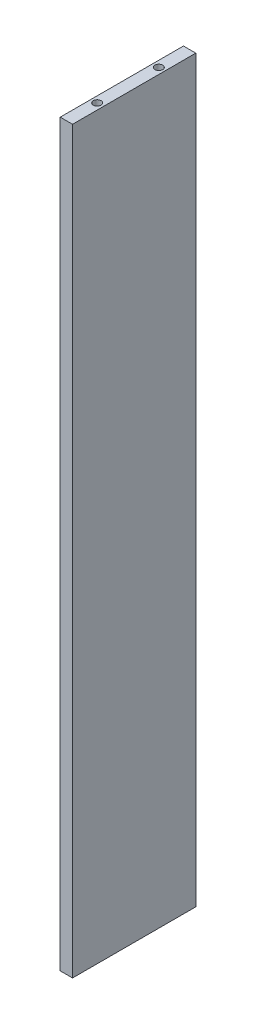
ISO-10303-21;
HEADER;
FILE_DESCRIPTION(('STEP AP214'),'2;1');
FILE_NAME('part.step','',(''),(''),'','','');
FILE_SCHEMA(('AUTOMOTIVE_DESIGN { 1 0 10303 214 1 1 1 1 }'));
ENDSEC;
DATA;
#1=APPLICATION_CONTEXT('core data for automotive mechanical design processes');
#2=APPLICATION_PROTOCOL_DEFINITION('international standard','automotive_design',2000,#1);
#3=PRODUCT_CONTEXT('',#1,'mechanical');
#4=PRODUCT('Part','Part','',(#3));
#5=PRODUCT_RELATED_PRODUCT_CATEGORY('part','',(#4));
#6=PRODUCT_DEFINITION_FORMATION('','',#4);
#7=PRODUCT_DEFINITION_CONTEXT('part definition',#1,'design');
#8=PRODUCT_DEFINITION('design','',#6,#7);
#9=PRODUCT_DEFINITION_SHAPE('','',#8);
#10=(LENGTH_UNIT() NAMED_UNIT(*) SI_UNIT(.MILLI.,.METRE.));
#11=(NAMED_UNIT(*) PLANE_ANGLE_UNIT() SI_UNIT($,.RADIAN.));
#12=(NAMED_UNIT(*) SI_UNIT($,.STERADIAN.) SOLID_ANGLE_UNIT());
#13=UNCERTAINTY_MEASURE_WITH_UNIT(LENGTH_MEASURE(1.E-05),#10,'distance_accuracy_value','');
#14=(GEOMETRIC_REPRESENTATION_CONTEXT(3) GLOBAL_UNCERTAINTY_ASSIGNED_CONTEXT((#13)) GLOBAL_UNIT_ASSIGNED_CONTEXT((#10,
#11,#12)) REPRESENTATION_CONTEXT('',''));
#15=CARTESIAN_POINT('',(0.,0.,0.));
#16=DIRECTION('',(0.,0.,1.));
#17=DIRECTION('',(1.,0.,0.));
#18=AXIS2_PLACEMENT_3D('',#15,#16,#17);
#19=CARTESIAN_POINT('',(0.439938024828799,381.,-58.0586527806087));
#20=DIRECTION('',(1.,0.,0.));
#21=DIRECTION('',(0.,0.,-1.));
#22=AXIS2_PLACEMENT_3D('',#19,#20,#21);
#23=PLANE('',#22);
#24=DIRECTION('',(0.,0.,1.));
#25=VECTOR('',#24,1.);
#26=CARTESIAN_POINT('',(0.439938024828799,0.,-58.0586527806087));
#27=LINE('',#26,#25);
#28=CARTESIAN_POINT('',(0.439938024828799,0.,-58.0586527806087));
#29=VERTEX_POINT('',#28);
#30=CARTESIAN_POINT('',(0.439938024828807,0.,5.44134721939132));
#31=VERTEX_POINT('',#30);
#32=EDGE_CURVE('E125',#29,#31,#27,.T.);
#33=ORIENTED_EDGE('',*,*,#32,.T.);
#34=DIRECTION('',(0.,-1.,0.));
#35=VECTOR('',#34,1.);
#36=CARTESIAN_POINT('',(0.439938024828807,381.,5.44134721939132));
#37=LINE('',#36,#35);
#38=CARTESIAN_POINT('',(0.439938024828807,381.,5.44134721939132));
#39=VERTEX_POINT('',#38);
#40=EDGE_CURVE('E11',#39,#31,#37,.T.);
#41=ORIENTED_EDGE('',*,*,#40,.F.);
#42=DIRECTION('',(0.,0.,1.));
#43=VECTOR('',#42,1.);
#44=CARTESIAN_POINT('',(0.439938024828799,381.,-58.0586527806087));
#45=LINE('',#44,#43);
#46=CARTESIAN_POINT('',(0.439938024828799,381.,-58.0586527806087));
#47=VERTEX_POINT('',#46);
#48=EDGE_CURVE('E126',#47,#39,#45,.T.);
#49=ORIENTED_EDGE('',*,*,#48,.F.);
#50=DIRECTION('',(0.,-1.,0.));
#51=VECTOR('',#50,1.);
#52=CARTESIAN_POINT('',(0.439938024828799,381.,-58.0586527806087));
#53=LINE('',#52,#51);
#54=EDGE_CURVE('E132',#47,#29,#53,.T.);
#55=ORIENTED_EDGE('',*,*,#54,.T.);
#56=EDGE_LOOP('',(#33,#41,#49,#55));
#57=FACE_BOUND('',#56,.T.);
#58=ADVANCED_FACE('F32',(#57),#23,.F.);
#59=CARTESIAN_POINT('',(0.439938024828807,381.,5.44134721939132));
#60=DIRECTION('',(0.,0.,-1.));
#61=DIRECTION('',(-1.,0.,0.));
#62=AXIS2_PLACEMENT_3D('',#59,#60,#61);
#63=PLANE('',#62);
#64=DIRECTION('',(1.,0.,0.));
#65=VECTOR('',#64,1.);
#66=CARTESIAN_POINT('',(0.439938024828807,0.,5.44134721939132));
#67=LINE('',#66,#65);
#68=CARTESIAN_POINT('',(6.78993802482881,0.,5.44134721939132));
#69=VERTEX_POINT('',#68);
#70=EDGE_CURVE('E135',#31,#69,#67,.T.);
#71=ORIENTED_EDGE('',*,*,#70,.T.);
#72=DIRECTION('',(0.,-1.,0.));
#73=VECTOR('',#72,1.);
#74=CARTESIAN_POINT('',(6.78993802482881,381.,5.44134721939132));
#75=LINE('',#74,#73);
#76=CARTESIAN_POINT('',(6.78993802482881,381.,5.44134721939132));
#77=VERTEX_POINT('',#76);
#78=EDGE_CURVE('E40',#77,#69,#75,.T.);
#79=ORIENTED_EDGE('',*,*,#78,.F.);
#80=DIRECTION('',(1.,0.,0.));
#81=VECTOR('',#80,1.);
#82=CARTESIAN_POINT('',(0.439938024828807,381.,5.44134721939132));
#83=LINE('',#82,#81);
#84=EDGE_CURVE('E79',#39,#77,#83,.T.);
#85=ORIENTED_EDGE('',*,*,#84,.F.);
#86=ORIENTED_EDGE('',*,*,#40,.T.);
#87=EDGE_LOOP('',(#71,#79,#85,#86));
#88=FACE_BOUND('',#87,.T.);
#89=ADVANCED_FACE('F159',(#88),#63,.F.);
#90=CARTESIAN_POINT('',(6.7899380248288,381.,-58.0586527806087));
#91=DIRECTION('',(-1.,0.,0.));
#92=DIRECTION('',(0.,0.,1.));
#93=AXIS2_PLACEMENT_3D('',#90,#91,#92);
#94=PLANE('',#93);
#95=DIRECTION('',(0.,0.,-1.));
#96=VECTOR('',#95,1.);
#97=CARTESIAN_POINT('',(6.7899380248288,0.,-58.0586527806087));
#98=LINE('',#97,#96);
#99=CARTESIAN_POINT('',(6.7899380248288,0.,-58.0586527806087));
#100=VERTEX_POINT('',#99);
#101=EDGE_CURVE('E66',#69,#100,#98,.T.);
#102=ORIENTED_EDGE('',*,*,#101,.T.);
#103=DIRECTION('',(0.,-1.,0.));
#104=VECTOR('',#103,1.);
#105=CARTESIAN_POINT('',(6.7899380248288,381.,-58.0586527806087));
#106=LINE('',#105,#104);
#107=CARTESIAN_POINT('',(6.7899380248288,381.,-58.0586527806087));
#108=VERTEX_POINT('',#107);
#109=EDGE_CURVE('E140',#108,#100,#106,.T.);
#110=ORIENTED_EDGE('',*,*,#109,.F.);
#111=DIRECTION('',(0.,0.,-1.));
#112=VECTOR('',#111,1.);
#113=CARTESIAN_POINT('',(6.7899380248288,381.,-58.0586527806087));
#114=LINE('',#113,#112);
#115=EDGE_CURVE('E129',#77,#108,#114,.T.);
#116=ORIENTED_EDGE('',*,*,#115,.F.);
#117=ORIENTED_EDGE('',*,*,#78,.T.);
#118=EDGE_LOOP('',(#102,#110,#116,#117));
#119=FACE_BOUND('',#118,.T.);
#120=ADVANCED_FACE('F142',(#119),#94,.F.);
#121=CARTESIAN_POINT('',(0.439938024828799,381.,-58.0586527806087));
#122=DIRECTION('',(0.,0.,1.));
#123=DIRECTION('',(1.,0.,0.));
#124=AXIS2_PLACEMENT_3D('',#121,#122,#123);
#125=PLANE('',#124);
#126=DIRECTION('',(-1.,0.,0.));
#127=VECTOR('',#126,1.);
#128=CARTESIAN_POINT('',(0.439938024828799,0.,-58.0586527806087));
#129=LINE('',#128,#127);
#130=EDGE_CURVE('E72',#100,#29,#129,.T.);
#131=ORIENTED_EDGE('',*,*,#130,.T.);
#132=ORIENTED_EDGE('',*,*,#54,.F.);
#133=DIRECTION('',(-1.,0.,0.));
#134=VECTOR('',#133,1.);
#135=CARTESIAN_POINT('',(0.439938024828799,381.,-58.0586527806087));
#136=LINE('',#135,#134);
#137=EDGE_CURVE('E48',#108,#47,#136,.T.);
#138=ORIENTED_EDGE('',*,*,#137,.F.);
#139=ORIENTED_EDGE('',*,*,#109,.T.);
#140=EDGE_LOOP('',(#131,#132,#138,#139));
#141=FACE_BOUND('',#140,.T.);
#142=ADVANCED_FACE('F149',(#141),#125,.F.);
#143=CARTESIAN_POINT('',(0.439938024828807,381.,5.44134721939132));
#144=DIRECTION('',(0.,1.,0.));
#145=DIRECTION('',(0.,0.,1.));
#146=AXIS2_PLACEMENT_3D('',#143,#144,#145);
#147=PLANE('',#146);
#148=CARTESIAN_POINT('',(3.6149380248288,381.,-42.1836527806087));
#149=DIRECTION('',(0.,1.,0.));
#150=DIRECTION('',(0.,0.,1.));
#151=AXIS2_PLACEMENT_3D('',#148,#149,#150);
#152=CIRCLE('',#151,2.0193);
#153=CARTESIAN_POINT('',(3.6149380248288,381.,-40.1643527806087));
#154=VERTEX_POINT('',#153);
#155=EDGE_CURVE('E113',#154,#154,#152,.T.);
#156=ORIENTED_EDGE('',*,*,#155,.F.);
#157=EDGE_LOOP('',(#156));
#158=FACE_BOUND('',#157,.T.);
#159=CARTESIAN_POINT('',(3.6149380248288,381.,-10.4336527806087));
#160=DIRECTION('',(0.,1.,0.));
#161=DIRECTION('',(0.,0.,1.));
#162=AXIS2_PLACEMENT_3D('',#159,#160,#161);
#163=CIRCLE('',#162,2.0193);
#164=CARTESIAN_POINT('',(3.6149380248288,381.,-8.41435278060868));
#165=VERTEX_POINT('',#164);
#166=EDGE_CURVE('E119',#165,#165,#163,.T.);
#167=ORIENTED_EDGE('',*,*,#166,.F.);
#168=EDGE_LOOP('',(#167));
#169=FACE_BOUND('',#168,.T.);
#170=ORIENTED_EDGE('',*,*,#48,.T.);
#171=ORIENTED_EDGE('',*,*,#84,.T.);
#172=ORIENTED_EDGE('',*,*,#115,.T.);
#173=ORIENTED_EDGE('',*,*,#137,.T.);
#174=EDGE_LOOP('',(#170,#171,#172,#173));
#175=FACE_BOUND('',#174,.T.);
#176=ADVANCED_FACE('F151',(#158,#169,#175),#147,.T.);
#177=CARTESIAN_POINT('',(0.439938024828807,0.,5.44134721939132));
#178=DIRECTION('',(0.,1.,0.));
#179=DIRECTION('',(0.,0.,1.));
#180=AXIS2_PLACEMENT_3D('',#177,#178,#179);
#181=PLANE('',#180);
#182=CARTESIAN_POINT('',(3.61493802482881,0.,-10.4336527806087));
#183=DIRECTION('',(0.,-1.,0.));
#184=DIRECTION('',(0.,0.,-1.));
#185=AXIS2_PLACEMENT_3D('',#182,#183,#184);
#186=CIRCLE('',#185,2.0193);
#187=CARTESIAN_POINT('',(3.61493802482881,0.,-12.4529527806087));
#188=VERTEX_POINT('',#187);
#189=EDGE_CURVE('E103',#188,#188,#186,.T.);
#190=ORIENTED_EDGE('',*,*,#189,.F.);
#191=EDGE_LOOP('',(#190));
#192=FACE_BOUND('',#191,.T.);
#193=CARTESIAN_POINT('',(3.61493802482881,0.,-42.1836527806087));
#194=DIRECTION('',(0.,-1.,0.));
#195=DIRECTION('',(0.,0.,-1.));
#196=AXIS2_PLACEMENT_3D('',#193,#194,#195);
#197=CIRCLE('',#196,2.0193);
#198=CARTESIAN_POINT('',(3.61493802482881,0.,-44.2029527806087));
#199=VERTEX_POINT('',#198);
#200=EDGE_CURVE('E102',#199,#199,#197,.T.);
#201=ORIENTED_EDGE('',*,*,#200,.F.);
#202=EDGE_LOOP('',(#201));
#203=FACE_BOUND('',#202,.T.);
#204=ORIENTED_EDGE('',*,*,#32,.F.);
#205=ORIENTED_EDGE('',*,*,#130,.F.);
#206=ORIENTED_EDGE('',*,*,#101,.F.);
#207=ORIENTED_EDGE('',*,*,#70,.F.);
#208=EDGE_LOOP('',(#204,#205,#206,#207));
#209=FACE_BOUND('',#208,.T.);
#210=ADVANCED_FACE('F145',(#192,#203,#209),#181,.F.);
#211=CARTESIAN_POINT('',(3.6149380248288,368.9,-10.4336527806087));
#212=DIRECTION('',(0.,1.,0.));
#213=DIRECTION('',(0.,0.,1.));
#214=AXIS2_PLACEMENT_3D('',#211,#212,#213);
#215=CONICAL_SURFACE('',#214,2.0193,1.02974425867666);
#216=CARTESIAN_POINT('',(3.6149380248288,367.686682151998,-10.4336527806087));
#217=VERTEX_POINT('',#216);
#218=VERTEX_LOOP('',#217);
#219=FACE_BOUND('',#218,.T.);
#220=CARTESIAN_POINT('',(3.6149380248288,368.9,-10.4336527806087));
#221=DIRECTION('',(0.,1.,0.));
#222=DIRECTION('',(0.,0.,1.));
#223=AXIS2_PLACEMENT_3D('',#220,#221,#222);
#224=CIRCLE('',#223,2.0193);
#225=CARTESIAN_POINT('',(3.6149380248288,368.9,-8.41435278060868));
#226=VERTEX_POINT('',#225);
#227=EDGE_CURVE('E122',#226,#226,#224,.T.);
#228=ORIENTED_EDGE('',*,*,#227,.T.);
#229=EDGE_LOOP('',(#228));
#230=FACE_BOUND('',#229,.T.);
#231=ADVANCED_FACE('F189',(#219,#230),#215,.F.);
#232=CARTESIAN_POINT('',(3.6149380248288,381.,-10.4336527806087));
#233=DIRECTION('',(0.,1.,0.));
#234=DIRECTION('',(0.,0.,1.));
#235=AXIS2_PLACEMENT_3D('',#232,#233,#234);
#236=CYLINDRICAL_SURFACE('',#235,2.0193);
#237=ORIENTED_EDGE('',*,*,#227,.F.);
#238=EDGE_LOOP('',(#237));
#239=FACE_BOUND('',#238,.T.);
#240=ORIENTED_EDGE('',*,*,#166,.T.);
#241=EDGE_LOOP('',(#240));
#242=FACE_BOUND('',#241,.T.);
#243=ADVANCED_FACE('F194',(#239,#242),#236,.F.);
#244=CARTESIAN_POINT('',(3.6149380248288,368.9,-42.1836527806087));
#245=DIRECTION('',(0.,1.,0.));
#246=DIRECTION('',(0.,0.,1.));
#247=AXIS2_PLACEMENT_3D('',#244,#245,#246);
#248=CONICAL_SURFACE('',#247,2.0193,1.02974425867666);
#249=CARTESIAN_POINT('',(3.6149380248288,367.686682151998,-42.1836527806087));
#250=VERTEX_POINT('',#249);
#251=VERTEX_LOOP('',#250);
#252=FACE_BOUND('',#251,.T.);
#253=CARTESIAN_POINT('',(3.6149380248288,368.9,-42.1836527806087));
#254=DIRECTION('',(0.,1.,0.));
#255=DIRECTION('',(0.,0.,1.));
#256=AXIS2_PLACEMENT_3D('',#253,#254,#255);
#257=CIRCLE('',#256,2.0193);
#258=CARTESIAN_POINT('',(3.6149380248288,368.9,-40.1643527806087));
#259=VERTEX_POINT('',#258);
#260=EDGE_CURVE('E116',#259,#259,#257,.T.);
#261=ORIENTED_EDGE('',*,*,#260,.T.);
#262=EDGE_LOOP('',(#261));
#263=FACE_BOUND('',#262,.T.);
#264=ADVANCED_FACE('F204',(#252,#263),#248,.F.);
#265=CARTESIAN_POINT('',(3.6149380248288,381.,-42.1836527806087));
#266=DIRECTION('',(0.,1.,0.));
#267=DIRECTION('',(0.,0.,1.));
#268=AXIS2_PLACEMENT_3D('',#265,#266,#267);
#269=CYLINDRICAL_SURFACE('',#268,2.0193);
#270=ORIENTED_EDGE('',*,*,#260,.F.);
#271=EDGE_LOOP('',(#270));
#272=FACE_BOUND('',#271,.T.);
#273=ORIENTED_EDGE('',*,*,#155,.T.);
#274=EDGE_LOOP('',(#273));
#275=FACE_BOUND('',#274,.T.);
#276=ADVANCED_FACE('F214',(#272,#275),#269,.F.);
#277=CARTESIAN_POINT('',(3.61493802482881,13.7,-42.1836527806087));
#278=DIRECTION('',(0.,-1.,0.));
#279=DIRECTION('',(0.,0.,-1.));
#280=AXIS2_PLACEMENT_3D('',#277,#278,#279);
#281=CONICAL_SURFACE('',#280,2.0193,1.02974425867665);
#282=CARTESIAN_POINT('',(3.61493802482881,14.9133178480024,-42.1836527806087));
#283=VERTEX_POINT('',#282);
#284=VERTEX_LOOP('',#283);
#285=FACE_BOUND('',#284,.T.);
#286=CARTESIAN_POINT('',(3.61493802482881,13.7,-42.1836527806087));
#287=DIRECTION('',(0.,-1.,0.));
#288=DIRECTION('',(0.,0.,-1.));
#289=AXIS2_PLACEMENT_3D('',#286,#287,#288);
#290=CIRCLE('',#289,2.0193);
#291=CARTESIAN_POINT('',(3.61493802482881,13.7,-44.2029527806087));
#292=VERTEX_POINT('',#291);
#293=EDGE_CURVE('E106',#292,#292,#290,.T.);
#294=ORIENTED_EDGE('',*,*,#293,.T.);
#295=EDGE_LOOP('',(#294));
#296=FACE_BOUND('',#295,.T.);
#297=ADVANCED_FACE('F224',(#285,#296),#281,.F.);
#298=CARTESIAN_POINT('',(3.61493802482881,0.,-42.1836527806087));
#299=DIRECTION('',(0.,-1.,0.));
#300=DIRECTION('',(0.,0.,-1.));
#301=AXIS2_PLACEMENT_3D('',#298,#299,#300);
#302=CYLINDRICAL_SURFACE('',#301,2.0193);
#303=ORIENTED_EDGE('',*,*,#293,.F.);
#304=EDGE_LOOP('',(#303));
#305=FACE_BOUND('',#304,.T.);
#306=ORIENTED_EDGE('',*,*,#200,.T.);
#307=EDGE_LOOP('',(#306));
#308=FACE_BOUND('',#307,.T.);
#309=ADVANCED_FACE('F96',(#305,#308),#302,.F.);
#310=CARTESIAN_POINT('',(3.61493802482881,13.7,-10.4336527806087));
#311=DIRECTION('',(0.,-1.,0.));
#312=DIRECTION('',(0.,0.,-1.));
#313=AXIS2_PLACEMENT_3D('',#310,#311,#312);
#314=CONICAL_SURFACE('',#313,2.0193,1.02974425867665);
#315=CARTESIAN_POINT('',(3.6149380248288,14.9133178480024,-10.4336527806087));
#316=VERTEX_POINT('',#315);
#317=VERTEX_LOOP('',#316);
#318=FACE_BOUND('',#317,.T.);
#319=CARTESIAN_POINT('',(3.61493802482881,13.7,-10.4336527806087));
#320=DIRECTION('',(0.,-1.,0.));
#321=DIRECTION('',(0.,0.,-1.));
#322=AXIS2_PLACEMENT_3D('',#319,#320,#321);
#323=CIRCLE('',#322,2.0193);
#324=CARTESIAN_POINT('',(3.61493802482881,13.7,-12.4529527806087));
#325=VERTEX_POINT('',#324);
#326=EDGE_CURVE('E100',#325,#325,#323,.T.);
#327=ORIENTED_EDGE('',*,*,#326,.T.);
#328=EDGE_LOOP('',(#327));
#329=FACE_BOUND('',#328,.T.);
#330=ADVANCED_FACE('F92',(#318,#329),#314,.F.);
#331=CARTESIAN_POINT('',(3.61493802482881,0.,-10.4336527806087));
#332=DIRECTION('',(0.,-1.,0.));
#333=DIRECTION('',(0.,0.,-1.));
#334=AXIS2_PLACEMENT_3D('',#331,#332,#333);
#335=CYLINDRICAL_SURFACE('',#334,2.0193);
#336=ORIENTED_EDGE('',*,*,#326,.F.);
#337=EDGE_LOOP('',(#336));
#338=FACE_BOUND('',#337,.T.);
#339=ORIENTED_EDGE('',*,*,#189,.T.);
#340=EDGE_LOOP('',(#339));
#341=FACE_BOUND('',#340,.T.);
#342=ADVANCED_FACE('F95',(#338,#341),#335,.F.);
#343=CLOSED_SHELL('',(#58,#89,#120,#142,#176,#210,#231,#243,#264,#276,#297,#309,#330,#342));
#344=MANIFOLD_SOLID_BREP('B2',#343);
#345=ADVANCED_BREP_SHAPE_REPRESENTATION('',(#18,#344),#14);
#346=SHAPE_DEFINITION_REPRESENTATION(#9,#345);
ENDSEC;
END-ISO-10303-21;
